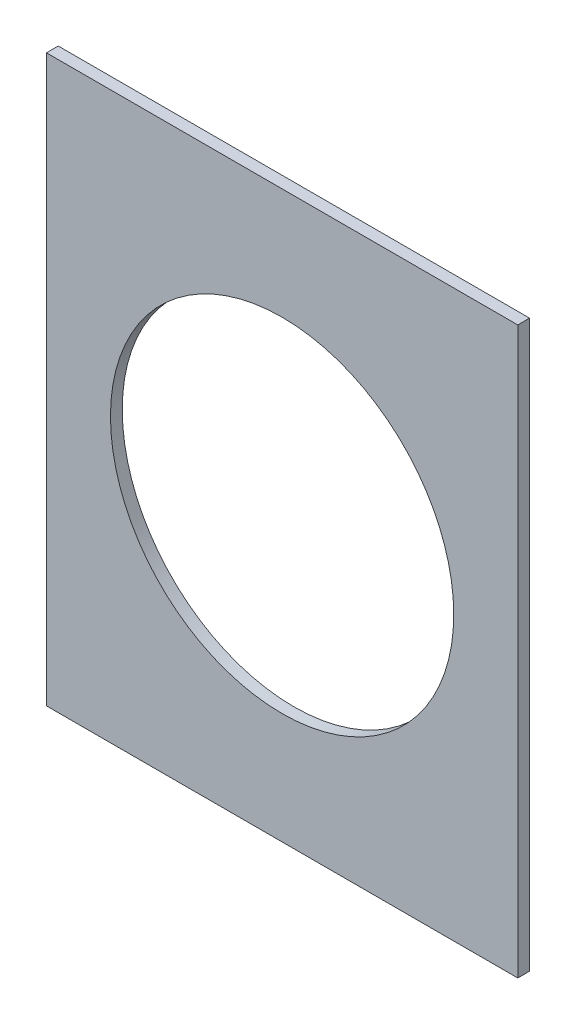
ISO-10303-21;
HEADER;
FILE_DESCRIPTION(('STEP AP214'),'2;1');
FILE_NAME('part.step','',(''),(''),'','','');
FILE_SCHEMA(('AUTOMOTIVE_DESIGN { 1 0 10303 214 1 1 1 1 }'));
ENDSEC;
DATA;
#1=APPLICATION_CONTEXT('core data for automotive mechanical design processes');
#2=APPLICATION_PROTOCOL_DEFINITION('international standard','automotive_design',2000,#1);
#3=PRODUCT_CONTEXT('',#1,'mechanical');
#4=PRODUCT('Part','Part','',(#3));
#5=PRODUCT_RELATED_PRODUCT_CATEGORY('part','',(#4));
#6=PRODUCT_DEFINITION_FORMATION('','',#4);
#7=PRODUCT_DEFINITION_CONTEXT('part definition',#1,'design');
#8=PRODUCT_DEFINITION('design','',#6,#7);
#9=PRODUCT_DEFINITION_SHAPE('','',#8);
#10=(LENGTH_UNIT() NAMED_UNIT(*) SI_UNIT(.MILLI.,.METRE.));
#11=(NAMED_UNIT(*) PLANE_ANGLE_UNIT() SI_UNIT($,.RADIAN.));
#12=(NAMED_UNIT(*) SI_UNIT($,.STERADIAN.) SOLID_ANGLE_UNIT());
#13=UNCERTAINTY_MEASURE_WITH_UNIT(LENGTH_MEASURE(1.E-05),#10,'distance_accuracy_value','');
#14=(GEOMETRIC_REPRESENTATION_CONTEXT(3) GLOBAL_UNCERTAINTY_ASSIGNED_CONTEXT((#13)) GLOBAL_UNIT_ASSIGNED_CONTEXT((#10,
#11,#12)) REPRESENTATION_CONTEXT('',''));
#15=CARTESIAN_POINT('',(0.,0.,0.));
#16=DIRECTION('',(0.,0.,1.));
#17=DIRECTION('',(1.,0.,0.));
#18=AXIS2_PLACEMENT_3D('',#15,#16,#17);
#19=CARTESIAN_POINT('',(-300.,-360.,15.));
#20=DIRECTION('',(1.,0.,0.));
#21=DIRECTION('',(0.,0.,-1.));
#22=AXIS2_PLACEMENT_3D('',#19,#20,#21);
#23=PLANE('',#22);
#24=DIRECTION('',(0.,-1.,0.));
#25=VECTOR('',#24,1.);
#26=CARTESIAN_POINT('',(-300.,-360.,0.));
#27=LINE('',#26,#25);
#28=CARTESIAN_POINT('',(-300.,360.,0.));
#29=VERTEX_POINT('',#28);
#30=CARTESIAN_POINT('',(-300.,-360.,0.));
#31=VERTEX_POINT('',#30);
#32=EDGE_CURVE('E98',#29,#31,#27,.T.);
#33=ORIENTED_EDGE('',*,*,#32,.T.);
#34=DIRECTION('',(0.,0.,-1.));
#35=VECTOR('',#34,1.);
#36=CARTESIAN_POINT('',(-300.,-360.,15.));
#37=LINE('',#36,#35);
#38=CARTESIAN_POINT('',(-300.,-360.,15.));
#39=VERTEX_POINT('',#38);
#40=EDGE_CURVE('E11',#39,#31,#37,.T.);
#41=ORIENTED_EDGE('',*,*,#40,.F.);
#42=DIRECTION('',(0.,-1.,0.));
#43=VECTOR('',#42,1.);
#44=CARTESIAN_POINT('',(-300.,-360.,15.));
#45=LINE('',#44,#43);
#46=CARTESIAN_POINT('',(-300.,360.,15.));
#47=VERTEX_POINT('',#46);
#48=EDGE_CURVE('E86',#47,#39,#45,.T.);
#49=ORIENTED_EDGE('',*,*,#48,.F.);
#50=DIRECTION('',(0.,0.,-1.));
#51=VECTOR('',#50,1.);
#52=CARTESIAN_POINT('',(-300.,360.,15.));
#53=LINE('',#52,#51);
#54=EDGE_CURVE('E94',#47,#29,#53,.T.);
#55=ORIENTED_EDGE('',*,*,#54,.T.);
#56=EDGE_LOOP('',(#33,#41,#49,#55));
#57=FACE_BOUND('',#56,.T.);
#58=ADVANCED_FACE('F35',(#57),#23,.F.);
#59=CARTESIAN_POINT('',(300.,-360.,15.));
#60=DIRECTION('',(0.,1.,0.));
#61=DIRECTION('',(-1.,0.,0.));
#62=AXIS2_PLACEMENT_3D('',#59,#60,#61);
#63=PLANE('',#62);
#64=DIRECTION('',(1.,0.,0.));
#65=VECTOR('',#64,1.);
#66=CARTESIAN_POINT('',(300.,-360.,0.));
#67=LINE('',#66,#65);
#68=CARTESIAN_POINT('',(300.,-360.,0.));
#69=VERTEX_POINT('',#68);
#70=EDGE_CURVE('E90',#31,#69,#67,.T.);
#71=ORIENTED_EDGE('',*,*,#70,.T.);
#72=DIRECTION('',(0.,0.,-1.));
#73=VECTOR('',#72,1.);
#74=CARTESIAN_POINT('',(300.,-360.,15.));
#75=LINE('',#74,#73);
#76=CARTESIAN_POINT('',(300.,-360.,15.));
#77=VERTEX_POINT('',#76);
#78=EDGE_CURVE('E43',#77,#69,#75,.T.);
#79=ORIENTED_EDGE('',*,*,#78,.F.);
#80=DIRECTION('',(1.,0.,0.));
#81=VECTOR('',#80,1.);
#82=CARTESIAN_POINT('',(300.,-360.,15.));
#83=LINE('',#82,#81);
#84=EDGE_CURVE('E81',#39,#77,#83,.T.);
#85=ORIENTED_EDGE('',*,*,#84,.F.);
#86=ORIENTED_EDGE('',*,*,#40,.T.);
#87=EDGE_LOOP('',(#71,#79,#85,#86));
#88=FACE_BOUND('',#87,.T.);
#89=ADVANCED_FACE('F89',(#88),#63,.F.);
#90=CARTESIAN_POINT('',(300.,-360.,15.));
#91=DIRECTION('',(-1.,0.,0.));
#92=DIRECTION('',(0.,0.,1.));
#93=AXIS2_PLACEMENT_3D('',#90,#91,#92);
#94=PLANE('',#93);
#95=DIRECTION('',(0.,1.,0.));
#96=VECTOR('',#95,1.);
#97=CARTESIAN_POINT('',(300.,-360.,0.));
#98=LINE('',#97,#96);
#99=CARTESIAN_POINT('',(300.,360.,0.));
#100=VERTEX_POINT('',#99);
#101=EDGE_CURVE('E68',#69,#100,#98,.T.);
#102=ORIENTED_EDGE('',*,*,#101,.T.);
#103=DIRECTION('',(0.,0.,-1.));
#104=VECTOR('',#103,1.);
#105=CARTESIAN_POINT('',(300.,360.,15.));
#106=LINE('',#105,#104);
#107=CARTESIAN_POINT('',(300.,360.,15.));
#108=VERTEX_POINT('',#107);
#109=EDGE_CURVE('E91',#108,#100,#106,.T.);
#110=ORIENTED_EDGE('',*,*,#109,.F.);
#111=DIRECTION('',(0.,1.,0.));
#112=VECTOR('',#111,1.);
#113=CARTESIAN_POINT('',(300.,-360.,15.));
#114=LINE('',#113,#112);
#115=EDGE_CURVE('E84',#77,#108,#114,.T.);
#116=ORIENTED_EDGE('',*,*,#115,.F.);
#117=ORIENTED_EDGE('',*,*,#78,.T.);
#118=EDGE_LOOP('',(#102,#110,#116,#117));
#119=FACE_BOUND('',#118,.T.);
#120=ADVANCED_FACE('F92',(#119),#94,.F.);
#121=CARTESIAN_POINT('',(300.,360.,15.));
#122=DIRECTION('',(0.,-1.,0.));
#123=DIRECTION('',(1.,0.,0.));
#124=AXIS2_PLACEMENT_3D('',#121,#122,#123);
#125=PLANE('',#124);
#126=DIRECTION('',(-1.,0.,0.));
#127=VECTOR('',#126,1.);
#128=CARTESIAN_POINT('',(300.,360.,0.));
#129=LINE('',#128,#127);
#130=EDGE_CURVE('E74',#100,#29,#129,.T.);
#131=ORIENTED_EDGE('',*,*,#130,.T.);
#132=ORIENTED_EDGE('',*,*,#54,.F.);
#133=DIRECTION('',(-1.,0.,0.));
#134=VECTOR('',#133,1.);
#135=CARTESIAN_POINT('',(300.,360.,15.));
#136=LINE('',#135,#134);
#137=EDGE_CURVE('E51',#108,#47,#136,.T.);
#138=ORIENTED_EDGE('',*,*,#137,.F.);
#139=ORIENTED_EDGE('',*,*,#109,.T.);
#140=EDGE_LOOP('',(#131,#132,#138,#139));
#141=FACE_BOUND('',#140,.T.);
#142=ADVANCED_FACE('F106',(#141),#125,.F.);
#143=CARTESIAN_POINT('',(0.,0.,15.));
#144=DIRECTION('',(0.,0.,1.));
#145=DIRECTION('',(1.,0.,0.));
#146=AXIS2_PLACEMENT_3D('',#143,#144,#145);
#147=PLANE('',#146);
#148=CARTESIAN_POINT('',(0.,0.,15.));
#149=DIRECTION('',(0.,0.,1.));
#150=DIRECTION('',(1.,0.,0.));
#151=AXIS2_PLACEMENT_3D('',#148,#149,#150);
#152=CIRCLE('',#151,218.5);
#153=CARTESIAN_POINT('',(218.5,0.,15.));
#154=VERTEX_POINT('',#153);
#155=EDGE_CURVE('E112',#154,#154,#152,.T.);
#156=ORIENTED_EDGE('',*,*,#155,.F.);
#157=EDGE_LOOP('',(#156));
#158=FACE_BOUND('',#157,.T.);
#159=ORIENTED_EDGE('',*,*,#48,.T.);
#160=ORIENTED_EDGE('',*,*,#84,.T.);
#161=ORIENTED_EDGE('',*,*,#115,.T.);
#162=ORIENTED_EDGE('',*,*,#137,.T.);
#163=EDGE_LOOP('',(#159,#160,#161,#162));
#164=FACE_BOUND('',#163,.T.);
#165=ADVANCED_FACE('F82',(#158,#164),#147,.T.);
#166=CARTESIAN_POINT('',(0.,0.,0.));
#167=DIRECTION('',(0.,0.,1.));
#168=DIRECTION('',(1.,0.,0.));
#169=AXIS2_PLACEMENT_3D('',#166,#167,#168);
#170=PLANE('',#169);
#171=CARTESIAN_POINT('',(0.,0.,0.));
#172=DIRECTION('',(0.,0.,1.));
#173=DIRECTION('',(1.,0.,0.));
#174=AXIS2_PLACEMENT_3D('',#171,#172,#173);
#175=CIRCLE('',#174,218.5);
#176=CARTESIAN_POINT('',(218.5,0.,0.));
#177=VERTEX_POINT('',#176);
#178=EDGE_CURVE('E101',#177,#177,#175,.T.);
#179=ORIENTED_EDGE('',*,*,#178,.T.);
#180=EDGE_LOOP('',(#179));
#181=FACE_BOUND('',#180,.T.);
#182=ORIENTED_EDGE('',*,*,#32,.F.);
#183=ORIENTED_EDGE('',*,*,#130,.F.);
#184=ORIENTED_EDGE('',*,*,#101,.F.);
#185=ORIENTED_EDGE('',*,*,#70,.F.);
#186=EDGE_LOOP('',(#182,#183,#184,#185));
#187=FACE_BOUND('',#186,.T.);
#188=ADVANCED_FACE('F109',(#181,#187),#170,.F.);
#189=CARTESIAN_POINT('',(0.,0.,0.));
#190=DIRECTION('',(0.,0.,1.));
#191=DIRECTION('',(1.,0.,0.));
#192=AXIS2_PLACEMENT_3D('',#189,#190,#191);
#193=CYLINDRICAL_SURFACE('',#192,218.5);
#194=ORIENTED_EDGE('',*,*,#178,.F.);
#195=EDGE_LOOP('',(#194));
#196=FACE_BOUND('',#195,.T.);
#197=ORIENTED_EDGE('',*,*,#155,.T.);
#198=EDGE_LOOP('',(#197));
#199=FACE_BOUND('',#198,.T.);
#200=ADVANCED_FACE('F119',(#196,#199),#193,.F.);
#201=CLOSED_SHELL('',(#58,#89,#120,#142,#165,#188,#200));
#202=MANIFOLD_SOLID_BREP('B2',#201);
#203=ADVANCED_BREP_SHAPE_REPRESENTATION('',(#18,#202),#14);
#204=SHAPE_DEFINITION_REPRESENTATION(#9,#203);
ENDSEC;
END-ISO-10303-21;
